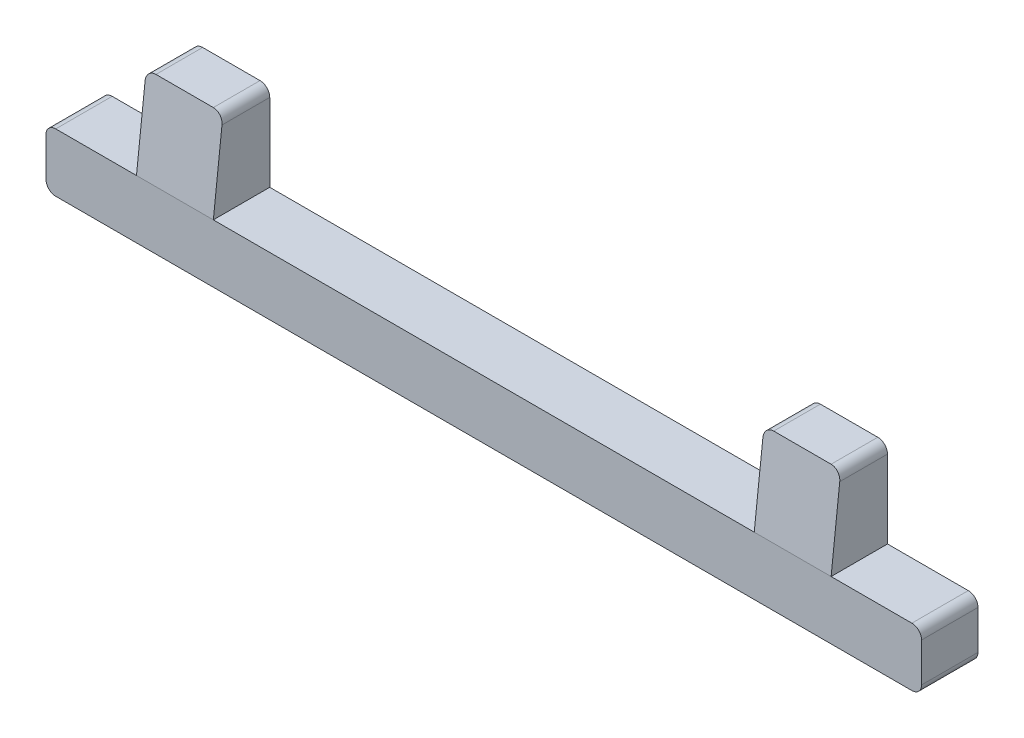
ISO-10303-21;
HEADER;
FILE_DESCRIPTION(('STEP AP214'),'2;1');
FILE_NAME('part.step','',(''),(''),'','','');
FILE_SCHEMA(('AUTOMOTIVE_DESIGN { 1 0 10303 214 1 1 1 1 }'));
ENDSEC;
DATA;
#1=APPLICATION_CONTEXT('core data for automotive mechanical design processes');
#2=APPLICATION_PROTOCOL_DEFINITION('international standard','automotive_design',2000,#1);
#3=PRODUCT_CONTEXT('',#1,'mechanical');
#4=PRODUCT('Part','Part','',(#3));
#5=PRODUCT_RELATED_PRODUCT_CATEGORY('part','',(#4));
#6=PRODUCT_DEFINITION_FORMATION('','',#4);
#7=PRODUCT_DEFINITION_CONTEXT('part definition',#1,'design');
#8=PRODUCT_DEFINITION('design','',#6,#7);
#9=PRODUCT_DEFINITION_SHAPE('','',#8);
#10=(LENGTH_UNIT() NAMED_UNIT(*) SI_UNIT(.MILLI.,.METRE.));
#11=(NAMED_UNIT(*) PLANE_ANGLE_UNIT() SI_UNIT($,.RADIAN.));
#12=(NAMED_UNIT(*) SI_UNIT($,.STERADIAN.) SOLID_ANGLE_UNIT());
#13=UNCERTAINTY_MEASURE_WITH_UNIT(LENGTH_MEASURE(1.E-05),#10,'distance_accuracy_value','');
#14=(GEOMETRIC_REPRESENTATION_CONTEXT(3) GLOBAL_UNCERTAINTY_ASSIGNED_CONTEXT((#13)) GLOBAL_UNIT_ASSIGNED_CONTEXT((#10,
#11,#12)) REPRESENTATION_CONTEXT('',''));
#15=CARTESIAN_POINT('',(0.,0.,0.));
#16=DIRECTION('',(0.,0.,1.));
#17=DIRECTION('',(1.,0.,0.));
#18=AXIS2_PLACEMENT_3D('',#15,#16,#17);
#19=CARTESIAN_POINT('',(0.,5.99999999999999,5.8));
#20=DIRECTION('',(1.,0.,0.));
#21=DIRECTION('',(0.,0.,-1.));
#22=AXIS2_PLACEMENT_3D('',#19,#20,#21);
#23=PLANE('',#22);
#24=DIRECTION('',(0.,-1.,0.));
#25=VECTOR('',#24,1.);
#26=CARTESIAN_POINT('',(0.,5.99999999999999,0.));
#27=LINE('',#26,#25);
#28=CARTESIAN_POINT('',(0.,4.99999999999999,0.));
#29=VERTEX_POINT('',#28);
#30=CARTESIAN_POINT('',(0.,1.,0.));
#31=VERTEX_POINT('',#30);
#32=EDGE_CURVE('E309',#29,#31,#27,.T.);
#33=ORIENTED_EDGE('',*,*,#32,.T.);
#34=DIRECTION('',(0.,0.,-1.));
#35=VECTOR('',#34,1.);
#36=CARTESIAN_POINT('',(0.,1.,5.8));
#37=LINE('',#36,#35);
#38=CARTESIAN_POINT('',(0.,1.,5.8));
#39=VERTEX_POINT('',#38);
#40=EDGE_CURVE('E249',#31,#39,#37,.F.);
#41=ORIENTED_EDGE('',*,*,#40,.T.);
#42=DIRECTION('',(0.,-1.,0.));
#43=VECTOR('',#42,1.);
#44=CARTESIAN_POINT('',(0.,5.99999999999999,5.8));
#45=LINE('',#44,#43);
#46=CARTESIAN_POINT('',(0.,4.99999999999999,5.8));
#47=VERTEX_POINT('',#46);
#48=EDGE_CURVE('E311',#47,#39,#45,.T.);
#49=ORIENTED_EDGE('',*,*,#48,.F.);
#50=DIRECTION('',(0.,0.,-1.));
#51=VECTOR('',#50,1.);
#52=CARTESIAN_POINT('',(0.,4.99999999999999,5.8));
#53=LINE('',#52,#51);
#54=EDGE_CURVE('E246',#47,#29,#53,.T.);
#55=ORIENTED_EDGE('',*,*,#54,.T.);
#56=EDGE_LOOP('',(#33,#41,#49,#55));
#57=FACE_BOUND('',#56,.T.);
#58=ADVANCED_FACE('F39',(#57),#23,.F.);
#59=CARTESIAN_POINT('',(0.,0.,5.8));
#60=DIRECTION('',(0.,1.,0.));
#61=DIRECTION('',(0.,0.,1.));
#62=AXIS2_PLACEMENT_3D('',#59,#60,#61);
#63=PLANE('',#62);
#64=DIRECTION('',(1.,0.,0.));
#65=VECTOR('',#64,1.);
#66=CARTESIAN_POINT('',(0.,0.,5.8));
#67=LINE('',#66,#65);
#68=CARTESIAN_POINT('',(1.,0.,5.8));
#69=VERTEX_POINT('',#68);
#70=CARTESIAN_POINT('',(89.,0.,5.8));
#71=VERTEX_POINT('',#70);
#72=EDGE_CURVE('E369',#69,#71,#67,.T.);
#73=ORIENTED_EDGE('',*,*,#72,.F.);
#74=DIRECTION('',(0.,0.,-1.));
#75=VECTOR('',#74,1.);
#76=CARTESIAN_POINT('',(1.,0.,5.8));
#77=LINE('',#76,#75);
#78=CARTESIAN_POINT('',(1.,0.,0.));
#79=VERTEX_POINT('',#78);
#80=EDGE_CURVE('E227',#69,#79,#77,.T.);
#81=ORIENTED_EDGE('',*,*,#80,.T.);
#82=DIRECTION('',(1.,0.,0.));
#83=VECTOR('',#82,1.);
#84=CARTESIAN_POINT('',(0.,0.,0.));
#85=LINE('',#84,#83);
#86=CARTESIAN_POINT('',(89.,0.,0.));
#87=VERTEX_POINT('',#86);
#88=EDGE_CURVE('E315',#79,#87,#85,.T.);
#89=ORIENTED_EDGE('',*,*,#88,.T.);
#90=DIRECTION('',(0.,0.,-1.));
#91=VECTOR('',#90,1.);
#92=CARTESIAN_POINT('',(89.,0.,5.8));
#93=LINE('',#92,#91);
#94=EDGE_CURVE('E225',#87,#71,#93,.F.);
#95=ORIENTED_EDGE('',*,*,#94,.T.);
#96=EDGE_LOOP('',(#73,#81,#89,#95));
#97=FACE_BOUND('',#96,.T.);
#98=ADVANCED_FACE('F407',(#97),#63,.F.);
#99=CARTESIAN_POINT('',(90.,0.,5.8));
#100=DIRECTION('',(-1.,0.,0.));
#101=DIRECTION('',(0.,0.,1.));
#102=AXIS2_PLACEMENT_3D('',#99,#100,#101);
#103=PLANE('',#102);
#104=DIRECTION('',(0.,1.,0.));
#105=VECTOR('',#104,1.);
#106=CARTESIAN_POINT('',(90.,0.,5.8));
#107=LINE('',#106,#105);
#108=CARTESIAN_POINT('',(90.,1.,5.8));
#109=VERTEX_POINT('',#108);
#110=CARTESIAN_POINT('',(90.,5.,5.8));
#111=VERTEX_POINT('',#110);
#112=EDGE_CURVE('E193',#109,#111,#107,.T.);
#113=ORIENTED_EDGE('',*,*,#112,.F.);
#114=DIRECTION('',(0.,0.,-1.));
#115=VECTOR('',#114,1.);
#116=CARTESIAN_POINT('',(90.,1.,5.8));
#117=LINE('',#116,#115);
#118=CARTESIAN_POINT('',(90.,1.,0.));
#119=VERTEX_POINT('',#118);
#120=EDGE_CURVE('E260',#109,#119,#117,.T.);
#121=ORIENTED_EDGE('',*,*,#120,.T.);
#122=DIRECTION('',(0.,1.,0.));
#123=VECTOR('',#122,1.);
#124=CARTESIAN_POINT('',(90.,0.,0.));
#125=LINE('',#124,#123);
#126=CARTESIAN_POINT('',(90.,5.,0.));
#127=VERTEX_POINT('',#126);
#128=EDGE_CURVE('E318',#119,#127,#125,.T.);
#129=ORIENTED_EDGE('',*,*,#128,.T.);
#130=DIRECTION('',(0.,0.,-1.));
#131=VECTOR('',#130,1.);
#132=CARTESIAN_POINT('',(90.,5.,5.8));
#133=LINE('',#132,#131);
#134=EDGE_CURVE('E258',#127,#111,#133,.F.);
#135=ORIENTED_EDGE('',*,*,#134,.T.);
#136=EDGE_LOOP('',(#113,#121,#129,#135));
#137=FACE_BOUND('',#136,.T.);
#138=ADVANCED_FACE('F392',(#137),#103,.F.);
#139=CARTESIAN_POINT('',(90.,6.,5.8));
#140=DIRECTION('',(0.,-1.,0.));
#141=DIRECTION('',(0.,0.,-1.));
#142=AXIS2_PLACEMENT_3D('',#139,#140,#141);
#143=PLANE('',#142);
#144=DIRECTION('',(-1.,0.,0.));
#145=VECTOR('',#144,1.);
#146=CARTESIAN_POINT('',(90.,6.,5.8));
#147=LINE('',#146,#145);
#148=CARTESIAN_POINT('',(89.,6.,5.8));
#149=VERTEX_POINT('',#148);
#150=CARTESIAN_POINT('',(80.7,6.,5.8));
#151=VERTEX_POINT('',#150);
#152=EDGE_CURVE('E178',#149,#151,#147,.T.);
#153=ORIENTED_EDGE('',*,*,#152,.F.);
#154=DIRECTION('',(0.,0.,-1.));
#155=VECTOR('',#154,1.);
#156=CARTESIAN_POINT('',(89.,6.,5.8));
#157=LINE('',#156,#155);
#158=CARTESIAN_POINT('',(89.,6.,0.));
#159=VERTEX_POINT('',#158);
#160=EDGE_CURVE('E263',#149,#159,#157,.T.);
#161=ORIENTED_EDGE('',*,*,#160,.T.);
#162=DIRECTION('',(-1.,0.,0.));
#163=VECTOR('',#162,1.);
#164=CARTESIAN_POINT('',(90.,6.,0.));
#165=LINE('',#164,#163);
#166=CARTESIAN_POINT('',(80.7,6.,0.));
#167=VERTEX_POINT('',#166);
#168=EDGE_CURVE('E217',#159,#167,#165,.T.);
#169=ORIENTED_EDGE('',*,*,#168,.T.);
#170=DIRECTION('',(0.,0.,-1.));
#171=VECTOR('',#170,1.);
#172=CARTESIAN_POINT('',(80.7,6.,5.8));
#173=LINE('',#172,#171);
#174=EDGE_CURVE('E204',#151,#167,#173,.T.);
#175=ORIENTED_EDGE('',*,*,#174,.F.);
#176=EDGE_LOOP('',(#153,#161,#169,#175));
#177=FACE_BOUND('',#176,.T.);
#178=ADVANCED_FACE('F215',(#177),#143,.F.);
#179=CARTESIAN_POINT('',(80.7,6.,5.8));
#180=DIRECTION('',(-1.,0.,0.));
#181=DIRECTION('',(0.,-1.,0.));
#182=AXIS2_PLACEMENT_3D('',#179,#180,#181);
#183=PLANE('',#182);
#184=DIRECTION('',(0.,1.,0.));
#185=VECTOR('',#184,1.);
#186=CARTESIAN_POINT('',(80.7,6.,0.));
#187=LINE('',#186,#185);
#188=CARTESIAN_POINT('',(80.7,14.,0.));
#189=VERTEX_POINT('',#188);
#190=EDGE_CURVE('E327',#167,#189,#187,.T.);
#191=ORIENTED_EDGE('',*,*,#190,.T.);
#192=DIRECTION('',(0.,0.,-1.));
#193=VECTOR('',#192,1.);
#194=CARTESIAN_POINT('',(80.7,14.,5.8));
#195=LINE('',#194,#193);
#196=CARTESIAN_POINT('',(80.7,14.,4.91111111111111));
#197=VERTEX_POINT('',#196);
#198=EDGE_CURVE('E212',#189,#197,#195,.F.);
#199=ORIENTED_EDGE('',*,*,#198,.T.);
#200=DIRECTION('',(0.,0.993883734673619,-0.110431526074847));
#201=VECTOR('',#200,1.);
#202=CARTESIAN_POINT('',(80.7,6.,5.8));
#203=LINE('',#202,#201);
#204=EDGE_CURVE('E199',#151,#197,#203,.T.);
#205=ORIENTED_EDGE('',*,*,#204,.F.);
#206=ORIENTED_EDGE('',*,*,#174,.T.);
#207=EDGE_LOOP('',(#191,#199,#205,#206));
#208=FACE_BOUND('',#207,.T.);
#209=ADVANCED_FACE('F209',(#208),#183,.F.);
#210=CARTESIAN_POINT('',(80.7,15.,5.8));
#211=DIRECTION('',(0.,-1.,0.));
#212=DIRECTION('',(0.,0.,-1.));
#213=AXIS2_PLACEMENT_3D('',#210,#211,#212);
#214=PLANE('',#213);
#215=DIRECTION('',(1.,0.,0.));
#216=VECTOR('',#215,1.);
#217=CARTESIAN_POINT('',(0.,15.,4.8));
#218=LINE('',#217,#216);
#219=CARTESIAN_POINT('',(73.8,15.,4.8));
#220=VERTEX_POINT('',#219);
#221=CARTESIAN_POINT('',(79.7,15.,4.8));
#222=VERTEX_POINT('',#221);
#223=EDGE_CURVE('E213',#220,#222,#218,.T.);
#224=ORIENTED_EDGE('',*,*,#223,.T.);
#225=DIRECTION('',(0.,0.,-1.));
#226=VECTOR('',#225,1.);
#227=CARTESIAN_POINT('',(79.7,15.,5.8));
#228=LINE('',#227,#226);
#229=CARTESIAN_POINT('',(79.7,15.,0.));
#230=VERTEX_POINT('',#229);
#231=EDGE_CURVE('E267',#222,#230,#228,.T.);
#232=ORIENTED_EDGE('',*,*,#231,.T.);
#233=DIRECTION('',(-1.,0.,0.));
#234=VECTOR('',#233,1.);
#235=CARTESIAN_POINT('',(80.7,15.,0.));
#236=LINE('',#235,#234);
#237=CARTESIAN_POINT('',(73.8,15.,0.));
#238=VERTEX_POINT('',#237);
#239=EDGE_CURVE('E329',#230,#238,#236,.T.);
#240=ORIENTED_EDGE('',*,*,#239,.T.);
#241=DIRECTION('',(0.,0.,-1.));
#242=VECTOR('',#241,1.);
#243=CARTESIAN_POINT('',(73.8,15.,5.8));
#244=LINE('',#243,#242);
#245=EDGE_CURVE('E265',#238,#220,#244,.F.);
#246=ORIENTED_EDGE('',*,*,#245,.T.);
#247=EDGE_LOOP('',(#224,#232,#240,#246));
#248=FACE_BOUND('',#247,.T.);
#249=ADVANCED_FACE('F380',(#248),#214,.F.);
#250=CARTESIAN_POINT('',(72.8,15.,5.8));
#251=DIRECTION('',(1.,0.,0.));
#252=DIRECTION('',(0.,0.,-1.));
#253=AXIS2_PLACEMENT_3D('',#250,#251,#252);
#254=PLANE('',#253);
#255=DIRECTION('',(0.,0.993883734673619,-0.110431526074847));
#256=VECTOR('',#255,1.);
#257=CARTESIAN_POINT('',(72.8,14.890243902439,4.81219512195122));
#258=LINE('',#257,#256);
#259=CARTESIAN_POINT('',(72.8,6.,5.8));
#260=VERTEX_POINT('',#259);
#261=CARTESIAN_POINT('',(72.8,14.,4.91111111111111));
#262=VERTEX_POINT('',#261);
#263=EDGE_CURVE('E202',#260,#262,#258,.T.);
#264=ORIENTED_EDGE('',*,*,#263,.T.);
#265=DIRECTION('',(0.,0.,-1.));
#266=VECTOR('',#265,1.);
#267=CARTESIAN_POINT('',(72.8,14.,5.8));
#268=LINE('',#267,#266);
#269=CARTESIAN_POINT('',(72.8,14.,0.));
#270=VERTEX_POINT('',#269);
#271=EDGE_CURVE('E275',#262,#270,#268,.T.);
#272=ORIENTED_EDGE('',*,*,#271,.T.);
#273=DIRECTION('',(0.,-1.,0.));
#274=VECTOR('',#273,1.);
#275=CARTESIAN_POINT('',(72.8,15.,0.));
#276=LINE('',#275,#274);
#277=CARTESIAN_POINT('',(72.8,6.,0.));
#278=VERTEX_POINT('',#277);
#279=EDGE_CURVE('E332',#270,#278,#276,.T.);
#280=ORIENTED_EDGE('',*,*,#279,.T.);
#281=DIRECTION('',(0.,0.,-1.));
#282=VECTOR('',#281,1.);
#283=CARTESIAN_POINT('',(72.8,6.,5.8));
#284=LINE('',#283,#282);
#285=EDGE_CURVE('E218',#260,#278,#284,.T.);
#286=ORIENTED_EDGE('',*,*,#285,.F.);
#287=EDGE_LOOP('',(#264,#272,#280,#286));
#288=FACE_BOUND('',#287,.T.);
#289=ADVANCED_FACE('F374',(#288),#254,.F.);
#290=CARTESIAN_POINT('',(72.8,6.,5.8));
#291=DIRECTION('',(0.,-1.,0.));
#292=DIRECTION('',(0.,0.,-1.));
#293=AXIS2_PLACEMENT_3D('',#290,#291,#292);
#294=PLANE('',#293);
#295=DIRECTION('',(-1.,0.,0.));
#296=VECTOR('',#295,1.);
#297=CARTESIAN_POINT('',(72.8,6.,0.));
#298=LINE('',#297,#296);
#299=CARTESIAN_POINT('',(17.2,6.,0.));
#300=VERTEX_POINT('',#299);
#301=EDGE_CURVE('E334',#278,#300,#298,.T.);
#302=ORIENTED_EDGE('',*,*,#301,.T.);
#303=DIRECTION('',(0.,0.,-1.));
#304=VECTOR('',#303,1.);
#305=CARTESIAN_POINT('',(17.2,6.,5.8));
#306=LINE('',#305,#304);
#307=CARTESIAN_POINT('',(17.2,6.,5.8));
#308=VERTEX_POINT('',#307);
#309=EDGE_CURVE('E221',#308,#300,#306,.T.);
#310=ORIENTED_EDGE('',*,*,#309,.F.);
#311=DIRECTION('',(-1.,0.,0.));
#312=VECTOR('',#311,1.);
#313=CARTESIAN_POINT('',(72.8,6.,5.8));
#314=LINE('',#313,#312);
#315=EDGE_CURVE('E192',#260,#308,#314,.T.);
#316=ORIENTED_EDGE('',*,*,#315,.F.);
#317=ORIENTED_EDGE('',*,*,#285,.T.);
#318=EDGE_LOOP('',(#302,#310,#316,#317));
#319=FACE_BOUND('',#318,.T.);
#320=ADVANCED_FACE('F372',(#319),#294,.F.);
#321=CARTESIAN_POINT('',(17.2,6.,5.8));
#322=DIRECTION('',(-1.,0.,0.));
#323=DIRECTION('',(0.,0.,1.));
#324=AXIS2_PLACEMENT_3D('',#321,#322,#323);
#325=PLANE('',#324);
#326=DIRECTION('',(0.,1.,0.));
#327=VECTOR('',#326,1.);
#328=CARTESIAN_POINT('',(17.2,6.,0.));
#329=LINE('',#328,#327);
#330=CARTESIAN_POINT('',(17.2,14.,0.));
#331=VERTEX_POINT('',#330);
#332=EDGE_CURVE('E336',#300,#331,#329,.T.);
#333=ORIENTED_EDGE('',*,*,#332,.T.);
#334=DIRECTION('',(0.,0.,-1.));
#335=VECTOR('',#334,1.);
#336=CARTESIAN_POINT('',(17.2,14.,5.8));
#337=LINE('',#336,#335);
#338=CARTESIAN_POINT('',(17.2,14.,4.91111111111111));
#339=VERTEX_POINT('',#338);
#340=EDGE_CURVE('E62',#331,#339,#337,.F.);
#341=ORIENTED_EDGE('',*,*,#340,.T.);
#342=DIRECTION('',(0.,-0.993883734673619,0.110431526074847));
#343=VECTOR('',#342,1.);
#344=CARTESIAN_POINT('',(17.2,6.,5.8));
#345=LINE('',#344,#343);
#346=EDGE_CURVE('E320',#339,#308,#345,.T.);
#347=ORIENTED_EDGE('',*,*,#346,.T.);
#348=ORIENTED_EDGE('',*,*,#309,.T.);
#349=EDGE_LOOP('',(#333,#341,#347,#348));
#350=FACE_BOUND('',#349,.T.);
#351=ADVANCED_FACE('F347',(#350),#325,.F.);
#352=CARTESIAN_POINT('',(17.2,15.,5.8));
#353=DIRECTION('',(0.,-1.,0.));
#354=DIRECTION('',(0.,0.,-1.));
#355=AXIS2_PLACEMENT_3D('',#352,#353,#354);
#356=PLANE('',#355);
#357=CARTESIAN_POINT('',(10.3,15.,4.8));
#358=VERTEX_POINT('',#357);
#359=CARTESIAN_POINT('',(16.2,15.,4.8));
#360=VERTEX_POINT('',#359);
#361=EDGE_CURVE('E361',#358,#360,#218,.T.);
#362=ORIENTED_EDGE('',*,*,#361,.T.);
#363=DIRECTION('',(0.,0.,-1.));
#364=VECTOR('',#363,1.);
#365=CARTESIAN_POINT('',(16.2,15.,5.8));
#366=LINE('',#365,#364);
#367=CARTESIAN_POINT('',(16.2,15.,0.));
#368=VERTEX_POINT('',#367);
#369=EDGE_CURVE('E280',#360,#368,#366,.T.);
#370=ORIENTED_EDGE('',*,*,#369,.T.);
#371=DIRECTION('',(-1.,0.,0.));
#372=VECTOR('',#371,1.);
#373=CARTESIAN_POINT('',(17.2,15.,0.));
#374=LINE('',#373,#372);
#375=CARTESIAN_POINT('',(10.3,15.,0.));
#376=VERTEX_POINT('',#375);
#377=EDGE_CURVE('E338',#368,#376,#374,.T.);
#378=ORIENTED_EDGE('',*,*,#377,.T.);
#379=DIRECTION('',(0.,0.,-1.));
#380=VECTOR('',#379,1.);
#381=CARTESIAN_POINT('',(10.3,15.,5.8));
#382=LINE('',#381,#380);
#383=EDGE_CURVE('E278',#376,#358,#382,.F.);
#384=ORIENTED_EDGE('',*,*,#383,.T.);
#385=EDGE_LOOP('',(#362,#370,#378,#384));
#386=FACE_BOUND('',#385,.T.);
#387=ADVANCED_FACE('F359',(#386),#356,.F.);
#388=CARTESIAN_POINT('',(9.29999999999999,15.,5.8));
#389=DIRECTION('',(1.,0.,0.));
#390=DIRECTION('',(0.,0.,-1.));
#391=AXIS2_PLACEMENT_3D('',#388,#389,#390);
#392=PLANE('',#391);
#393=DIRECTION('',(0.,0.993883734673619,-0.110431526074847));
#394=VECTOR('',#393,1.);
#395=CARTESIAN_POINT('',(9.29999999999999,14.890243902439,4.81219512195122));
#396=LINE('',#395,#394);
#397=CARTESIAN_POINT('',(9.29999999999999,6.,5.8));
#398=VERTEX_POINT('',#397);
#399=CARTESIAN_POINT('',(9.29999999999999,14.,4.91111111111111));
#400=VERTEX_POINT('',#399);
#401=EDGE_CURVE('E362',#398,#400,#396,.T.);
#402=ORIENTED_EDGE('',*,*,#401,.T.);
#403=DIRECTION('',(0.,0.,-1.));
#404=VECTOR('',#403,1.);
#405=CARTESIAN_POINT('',(9.29999999999999,14.,5.8));
#406=LINE('',#405,#404);
#407=CARTESIAN_POINT('',(9.29999999999999,14.,0.));
#408=VERTEX_POINT('',#407);
#409=EDGE_CURVE('E11',#400,#408,#406,.T.);
#410=ORIENTED_EDGE('',*,*,#409,.T.);
#411=DIRECTION('',(0.,-1.,0.));
#412=VECTOR('',#411,1.);
#413=CARTESIAN_POINT('',(9.29999999999999,15.,0.));
#414=LINE('',#413,#412);
#415=CARTESIAN_POINT('',(9.29999999999999,6.,0.));
#416=VERTEX_POINT('',#415);
#417=EDGE_CURVE('E341',#408,#416,#414,.T.);
#418=ORIENTED_EDGE('',*,*,#417,.T.);
#419=DIRECTION('',(0.,0.,-1.));
#420=VECTOR('',#419,1.);
#421=CARTESIAN_POINT('',(9.29999999999999,6.,5.8));
#422=LINE('',#421,#420);
#423=EDGE_CURVE('E302',#398,#416,#422,.T.);
#424=ORIENTED_EDGE('',*,*,#423,.F.);
#425=EDGE_LOOP('',(#402,#410,#418,#424));
#426=FACE_BOUND('',#425,.T.);
#427=ADVANCED_FACE('F439',(#426),#392,.F.);
#428=CARTESIAN_POINT('',(9.29999999999999,6.,5.8));
#429=DIRECTION('',(0.,-1.,0.));
#430=DIRECTION('',(1.,0.,0.));
#431=AXIS2_PLACEMENT_3D('',#428,#429,#430);
#432=PLANE('',#431);
#433=DIRECTION('',(-1.,0.,0.));
#434=VECTOR('',#433,1.);
#435=CARTESIAN_POINT('',(9.29999999999999,6.,0.));
#436=LINE('',#435,#434);
#437=CARTESIAN_POINT('',(0.999999999999999,5.99999999999999,0.));
#438=VERTEX_POINT('',#437);
#439=EDGE_CURVE('E295',#416,#438,#436,.T.);
#440=ORIENTED_EDGE('',*,*,#439,.T.);
#441=DIRECTION('',(0.,0.,-1.));
#442=VECTOR('',#441,1.);
#443=CARTESIAN_POINT('',(0.999999999999999,5.99999999999999,5.8));
#444=LINE('',#443,#442);
#445=CARTESIAN_POINT('',(0.999999999999999,5.99999999999999,5.8));
#446=VERTEX_POINT('',#445);
#447=EDGE_CURVE('E47',#438,#446,#444,.F.);
#448=ORIENTED_EDGE('',*,*,#447,.T.);
#449=DIRECTION('',(-1.,0.,0.));
#450=VECTOR('',#449,1.);
#451=CARTESIAN_POINT('',(9.29999999999999,6.,5.8));
#452=LINE('',#451,#450);
#453=EDGE_CURVE('E293',#398,#446,#452,.T.);
#454=ORIENTED_EDGE('',*,*,#453,.F.);
#455=ORIENTED_EDGE('',*,*,#423,.T.);
#456=EDGE_LOOP('',(#440,#448,#454,#455));
#457=FACE_BOUND('',#456,.T.);
#458=ADVANCED_FACE('F291',(#457),#432,.F.);
#459=CARTESIAN_POINT('',(0.,0.,5.8));
#460=DIRECTION('',(0.,0.,1.));
#461=DIRECTION('',(1.,0.,0.));
#462=AXIS2_PLACEMENT_3D('',#459,#460,#461);
#463=PLANE('',#462);
#464=ORIENTED_EDGE('',*,*,#48,.T.);
#465=CARTESIAN_POINT('',(1.,1.,5.8));
#466=DIRECTION('',(0.,0.,1.));
#467=DIRECTION('',(1.,0.,0.));
#468=AXIS2_PLACEMENT_3D('',#465,#466,#467);
#469=CIRCLE('',#468,1.);
#470=EDGE_CURVE('E256',#39,#69,#469,.T.);
#471=ORIENTED_EDGE('',*,*,#470,.T.);
#472=ORIENTED_EDGE('',*,*,#72,.T.);
#473=CARTESIAN_POINT('',(89.,1.,5.8));
#474=DIRECTION('',(0.,0.,1.));
#475=DIRECTION('',(1.,0.,0.));
#476=AXIS2_PLACEMENT_3D('',#473,#474,#475);
#477=CIRCLE('',#476,1.);
#478=EDGE_CURVE('E254',#71,#109,#477,.T.);
#479=ORIENTED_EDGE('',*,*,#478,.T.);
#480=ORIENTED_EDGE('',*,*,#112,.T.);
#481=CARTESIAN_POINT('',(89.,5.,5.8));
#482=DIRECTION('',(0.,0.,1.));
#483=DIRECTION('',(1.,0.,0.));
#484=AXIS2_PLACEMENT_3D('',#481,#482,#483);
#485=CIRCLE('',#484,1.);
#486=EDGE_CURVE('E187',#111,#149,#485,.T.);
#487=ORIENTED_EDGE('',*,*,#486,.T.);
#488=ORIENTED_EDGE('',*,*,#152,.T.);
#489=DIRECTION('',(1.,0.,0.));
#490=VECTOR('',#489,1.);
#491=CARTESIAN_POINT('',(0.,6.,5.8));
#492=LINE('',#491,#490);
#493=EDGE_CURVE('E183',#260,#151,#492,.T.);
#494=ORIENTED_EDGE('',*,*,#493,.F.);
#495=ORIENTED_EDGE('',*,*,#315,.T.);
#496=EDGE_CURVE('E203',#398,#308,#492,.T.);
#497=ORIENTED_EDGE('',*,*,#496,.F.);
#498=ORIENTED_EDGE('',*,*,#453,.T.);
#499=CARTESIAN_POINT('',(1.,4.99999999999999,5.8));
#500=DIRECTION('',(0.,0.,1.));
#501=DIRECTION('',(1.,0.,0.));
#502=AXIS2_PLACEMENT_3D('',#499,#500,#501);
#503=CIRCLE('',#502,1.);
#504=EDGE_CURVE('E251',#446,#47,#503,.T.);
#505=ORIENTED_EDGE('',*,*,#504,.T.);
#506=EDGE_LOOP('',(#464,#471,#472,#479,#480,#487,#488,#494,#495,#497,#498,#505));
#507=FACE_BOUND('',#506,.T.);
#508=ADVANCED_FACE('F181',(#507),#463,.T.);
#509=CARTESIAN_POINT('',(0.,0.,0.));
#510=DIRECTION('',(0.,0.,1.));
#511=DIRECTION('',(1.,0.,0.));
#512=AXIS2_PLACEMENT_3D('',#509,#510,#511);
#513=PLANE('',#512);
#514=ORIENTED_EDGE('',*,*,#88,.F.);
#515=CARTESIAN_POINT('',(1.,1.,0.));
#516=DIRECTION('',(0.,0.,1.));
#517=DIRECTION('',(1.,0.,0.));
#518=AXIS2_PLACEMENT_3D('',#515,#516,#517);
#519=CIRCLE('',#518,1.);
#520=EDGE_CURVE('E244',#79,#31,#519,.F.);
#521=ORIENTED_EDGE('',*,*,#520,.T.);
#522=ORIENTED_EDGE('',*,*,#32,.F.);
#523=CARTESIAN_POINT('',(1.,4.99999999999999,0.));
#524=DIRECTION('',(0.,0.,1.));
#525=DIRECTION('',(1.,0.,0.));
#526=AXIS2_PLACEMENT_3D('',#523,#524,#525);
#527=CIRCLE('',#526,1.);
#528=EDGE_CURVE('E232',#29,#438,#527,.F.);
#529=ORIENTED_EDGE('',*,*,#528,.T.);
#530=ORIENTED_EDGE('',*,*,#439,.F.);
#531=ORIENTED_EDGE('',*,*,#417,.F.);
#532=CARTESIAN_POINT('',(10.3,14.,0.));
#533=DIRECTION('',(0.,0.,1.));
#534=DIRECTION('',(1.,0.,0.));
#535=AXIS2_PLACEMENT_3D('',#532,#533,#534);
#536=CIRCLE('',#535,1.);
#537=EDGE_CURVE('E230',#408,#376,#536,.F.);
#538=ORIENTED_EDGE('',*,*,#537,.T.);
#539=ORIENTED_EDGE('',*,*,#377,.F.);
#540=CARTESIAN_POINT('',(16.2,14.,0.));
#541=DIRECTION('',(0.,0.,1.));
#542=DIRECTION('',(1.,0.,0.));
#543=AXIS2_PLACEMENT_3D('',#540,#541,#542);
#544=CIRCLE('',#543,1.);
#545=EDGE_CURVE('E234',#368,#331,#544,.F.);
#546=ORIENTED_EDGE('',*,*,#545,.T.);
#547=ORIENTED_EDGE('',*,*,#332,.F.);
#548=ORIENTED_EDGE('',*,*,#301,.F.);
#549=ORIENTED_EDGE('',*,*,#279,.F.);
#550=CARTESIAN_POINT('',(73.8,14.,0.));
#551=DIRECTION('',(0.,0.,1.));
#552=DIRECTION('',(1.,0.,0.));
#553=AXIS2_PLACEMENT_3D('',#550,#551,#552);
#554=CIRCLE('',#553,1.);
#555=EDGE_CURVE('E236',#270,#238,#554,.F.);
#556=ORIENTED_EDGE('',*,*,#555,.T.);
#557=ORIENTED_EDGE('',*,*,#239,.F.);
#558=CARTESIAN_POINT('',(79.7,14.,0.));
#559=DIRECTION('',(0.,0.,1.));
#560=DIRECTION('',(1.,0.,0.));
#561=AXIS2_PLACEMENT_3D('',#558,#559,#560);
#562=CIRCLE('',#561,1.);
#563=EDGE_CURVE('E238',#230,#189,#562,.F.);
#564=ORIENTED_EDGE('',*,*,#563,.T.);
#565=ORIENTED_EDGE('',*,*,#190,.F.);
#566=ORIENTED_EDGE('',*,*,#168,.F.);
#567=CARTESIAN_POINT('',(89.,5.,0.));
#568=DIRECTION('',(0.,0.,1.));
#569=DIRECTION('',(1.,0.,0.));
#570=AXIS2_PLACEMENT_3D('',#567,#568,#569);
#571=CIRCLE('',#570,1.);
#572=EDGE_CURVE('E240',#159,#127,#571,.F.);
#573=ORIENTED_EDGE('',*,*,#572,.T.);
#574=ORIENTED_EDGE('',*,*,#128,.F.);
#575=CARTESIAN_POINT('',(89.,1.,0.));
#576=DIRECTION('',(0.,0.,1.));
#577=DIRECTION('',(1.,0.,0.));
#578=AXIS2_PLACEMENT_3D('',#575,#576,#577);
#579=CIRCLE('',#578,1.);
#580=EDGE_CURVE('E242',#119,#87,#579,.F.);
#581=ORIENTED_EDGE('',*,*,#580,.T.);
#582=EDGE_LOOP('',(#514,#521,#522,#529,#530,#531,#538,#539,#546,#547,#548,#549,#556,#557,#564,
#565,#566,#573,#574,#581));
#583=FACE_BOUND('',#582,.T.);
#584=ADVANCED_FACE('F314',(#583),#513,.F.);
#585=CARTESIAN_POINT('',(0.,6.,5.8));
#586=DIRECTION('',(0.,-0.110431526074847,-0.993883734673619));
#587=DIRECTION('',(0.,0.993883734673619,-0.110431526074847));
#588=AXIS2_PLACEMENT_3D('',#585,#586,#587);
#589=PLANE('',#588);
#590=ORIENTED_EDGE('',*,*,#204,.T.);
#591=CARTESIAN_POINT('',(79.7,14.,4.91111111111111));
#592=DIRECTION('',(0.,-0.110431526074847,-0.993883734673619));
#593=DIRECTION('',(0.,0.993883734673619,-0.110431526074847));
#594=AXIS2_PLACEMENT_3D('',#591,#592,#593);
#595=ELLIPSE('',#594,1.00615390423749,1.);
#596=EDGE_CURVE('E273',#197,#222,#595,.F.);
#597=ORIENTED_EDGE('',*,*,#596,.T.);
#598=ORIENTED_EDGE('',*,*,#223,.F.);
#599=CARTESIAN_POINT('',(73.8,14.,4.91111111111111));
#600=DIRECTION('',(0.,-0.110431526074847,-0.993883734673619));
#601=DIRECTION('',(0.,0.993883734673619,-0.110431526074847));
#602=AXIS2_PLACEMENT_3D('',#599,#600,#601);
#603=ELLIPSE('',#602,1.00615390423749,1.);
#604=EDGE_CURVE('E271',#220,#262,#603,.F.);
#605=ORIENTED_EDGE('',*,*,#604,.T.);
#606=ORIENTED_EDGE('',*,*,#263,.F.);
#607=ORIENTED_EDGE('',*,*,#493,.T.);
#608=EDGE_LOOP('',(#590,#597,#598,#605,#606,#607));
#609=FACE_BOUND('',#608,.T.);
#610=ADVANCED_FACE('F198',(#609),#589,.F.);
#611=ORIENTED_EDGE('',*,*,#346,.F.);
#612=CARTESIAN_POINT('',(16.2,14.,4.91111111111111));
#613=DIRECTION('',(0.,-0.110431526074847,-0.993883734673619));
#614=DIRECTION('',(0.,0.993883734673619,-0.110431526074847));
#615=AXIS2_PLACEMENT_3D('',#612,#613,#614);
#616=ELLIPSE('',#615,1.00615390423749,1.);
#617=EDGE_CURVE('E285',#339,#360,#616,.F.);
#618=ORIENTED_EDGE('',*,*,#617,.T.);
#619=ORIENTED_EDGE('',*,*,#361,.F.);
#620=CARTESIAN_POINT('',(10.3,14.,4.91111111111111));
#621=DIRECTION('',(0.,-0.110431526074847,-0.993883734673619));
#622=DIRECTION('',(0.,0.993883734673619,-0.110431526074847));
#623=AXIS2_PLACEMENT_3D('',#620,#621,#622);
#624=ELLIPSE('',#623,1.00615390423749,1.);
#625=EDGE_CURVE('E54',#358,#400,#624,.F.);
#626=ORIENTED_EDGE('',*,*,#625,.T.);
#627=ORIENTED_EDGE('',*,*,#401,.F.);
#628=ORIENTED_EDGE('',*,*,#496,.T.);
#629=EDGE_LOOP('',(#611,#618,#619,#626,#627,#628));
#630=FACE_BOUND('',#629,.T.);
#631=ADVANCED_FACE('F418',(#630),#589,.F.);
#632=CARTESIAN_POINT('',(1.,1.,5.8));
#633=DIRECTION('',(0.,0.,-1.));
#634=DIRECTION('',(-1.,0.,0.));
#635=AXIS2_PLACEMENT_3D('',#632,#633,#634);
#636=CYLINDRICAL_SURFACE('',#635,1.);
#637=ORIENTED_EDGE('',*,*,#470,.F.);
#638=ORIENTED_EDGE('',*,*,#40,.F.);
#639=ORIENTED_EDGE('',*,*,#520,.F.);
#640=ORIENTED_EDGE('',*,*,#80,.F.);
#641=EDGE_LOOP('',(#637,#638,#639,#640));
#642=FACE_BOUND('',#641,.T.);
#643=ADVANCED_FACE('F403',(#642),#636,.T.);
#644=CARTESIAN_POINT('',(89.,1.,5.8));
#645=DIRECTION('',(0.,0.,-1.));
#646=DIRECTION('',(-1.,0.,0.));
#647=AXIS2_PLACEMENT_3D('',#644,#645,#646);
#648=CYLINDRICAL_SURFACE('',#647,1.);
#649=ORIENTED_EDGE('',*,*,#478,.F.);
#650=ORIENTED_EDGE('',*,*,#94,.F.);
#651=ORIENTED_EDGE('',*,*,#580,.F.);
#652=ORIENTED_EDGE('',*,*,#120,.F.);
#653=EDGE_LOOP('',(#649,#650,#651,#652));
#654=FACE_BOUND('',#653,.T.);
#655=ADVANCED_FACE('F396',(#654),#648,.T.);
#656=CARTESIAN_POINT('',(89.,5.,5.8));
#657=DIRECTION('',(0.,0.,-1.));
#658=DIRECTION('',(-1.,0.,0.));
#659=AXIS2_PLACEMENT_3D('',#656,#657,#658);
#660=CYLINDRICAL_SURFACE('',#659,1.);
#661=ORIENTED_EDGE('',*,*,#486,.F.);
#662=ORIENTED_EDGE('',*,*,#134,.F.);
#663=ORIENTED_EDGE('',*,*,#572,.F.);
#664=ORIENTED_EDGE('',*,*,#160,.F.);
#665=EDGE_LOOP('',(#661,#662,#663,#664));
#666=FACE_BOUND('',#665,.T.);
#667=ADVANCED_FACE('F394',(#666),#660,.T.);
#668=CARTESIAN_POINT('',(79.7,14.,5.8));
#669=DIRECTION('',(0.,0.,-1.));
#670=DIRECTION('',(-1.,0.,0.));
#671=AXIS2_PLACEMENT_3D('',#668,#669,#670);
#672=CYLINDRICAL_SURFACE('',#671,1.);
#673=ORIENTED_EDGE('',*,*,#596,.F.);
#674=ORIENTED_EDGE('',*,*,#198,.F.);
#675=ORIENTED_EDGE('',*,*,#563,.F.);
#676=ORIENTED_EDGE('',*,*,#231,.F.);
#677=EDGE_LOOP('',(#673,#674,#675,#676));
#678=FACE_BOUND('',#677,.T.);
#679=ADVANCED_FACE('F386',(#678),#672,.T.);
#680=CARTESIAN_POINT('',(73.8,14.,5.8));
#681=DIRECTION('',(0.,0.,-1.));
#682=DIRECTION('',(-1.,0.,0.));
#683=AXIS2_PLACEMENT_3D('',#680,#681,#682);
#684=CYLINDRICAL_SURFACE('',#683,1.);
#685=ORIENTED_EDGE('',*,*,#604,.F.);
#686=ORIENTED_EDGE('',*,*,#245,.F.);
#687=ORIENTED_EDGE('',*,*,#555,.F.);
#688=ORIENTED_EDGE('',*,*,#271,.F.);
#689=EDGE_LOOP('',(#685,#686,#687,#688));
#690=FACE_BOUND('',#689,.T.);
#691=ADVANCED_FACE('F384',(#690),#684,.T.);
#692=CARTESIAN_POINT('',(16.2,14.,5.8));
#693=DIRECTION('',(0.,0.,-1.));
#694=DIRECTION('',(-1.,0.,0.));
#695=AXIS2_PLACEMENT_3D('',#692,#693,#694);
#696=CYLINDRICAL_SURFACE('',#695,1.);
#697=ORIENTED_EDGE('',*,*,#617,.F.);
#698=ORIENTED_EDGE('',*,*,#340,.F.);
#699=ORIENTED_EDGE('',*,*,#545,.F.);
#700=ORIENTED_EDGE('',*,*,#369,.F.);
#701=EDGE_LOOP('',(#697,#698,#699,#700));
#702=FACE_BOUND('',#701,.T.);
#703=ADVANCED_FACE('F356',(#702),#696,.T.);
#704=CARTESIAN_POINT('',(1.,4.99999999999999,5.8));
#705=DIRECTION('',(0.,0.,-1.));
#706=DIRECTION('',(-1.,0.,0.));
#707=AXIS2_PLACEMENT_3D('',#704,#705,#706);
#708=CYLINDRICAL_SURFACE('',#707,1.);
#709=ORIENTED_EDGE('',*,*,#504,.F.);
#710=ORIENTED_EDGE('',*,*,#447,.F.);
#711=ORIENTED_EDGE('',*,*,#528,.F.);
#712=ORIENTED_EDGE('',*,*,#54,.F.);
#713=EDGE_LOOP('',(#709,#710,#711,#712));
#714=FACE_BOUND('',#713,.T.);
#715=ADVANCED_FACE('F305',(#714),#708,.T.);
#716=CARTESIAN_POINT('',(10.3,14.,5.8));
#717=DIRECTION('',(0.,0.,-1.));
#718=DIRECTION('',(-1.,0.,0.));
#719=AXIS2_PLACEMENT_3D('',#716,#717,#718);
#720=CYLINDRICAL_SURFACE('',#719,1.);
#721=ORIENTED_EDGE('',*,*,#625,.F.);
#722=ORIENTED_EDGE('',*,*,#383,.F.);
#723=ORIENTED_EDGE('',*,*,#537,.F.);
#724=ORIENTED_EDGE('',*,*,#409,.F.);
#725=EDGE_LOOP('',(#721,#722,#723,#724));
#726=FACE_BOUND('',#725,.T.);
#727=ADVANCED_FACE('F41',(#726),#720,.T.);
#728=CLOSED_SHELL('',(#58,#98,#138,#178,#209,#249,#289,#320,#351,#387,#427,#458,#508,#584,#610,
#631,#643,#655,#667,#679,#691,#703,#715,#727));
#729=MANIFOLD_SOLID_BREP('B2',#728);
#730=ADVANCED_BREP_SHAPE_REPRESENTATION('',(#18,#729),#14);
#731=SHAPE_DEFINITION_REPRESENTATION(#9,#730);
ENDSEC;
END-ISO-10303-21;
